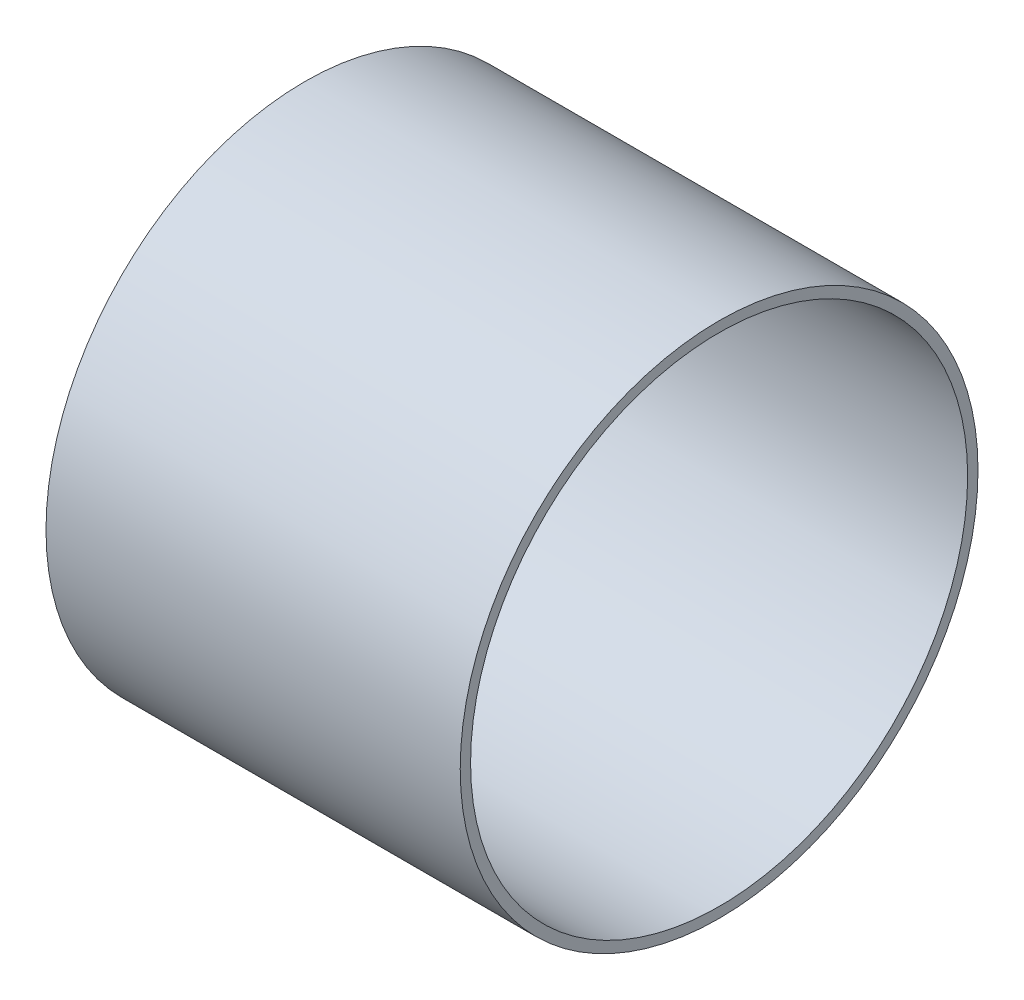
ISO-10303-21;
HEADER;
FILE_DESCRIPTION(('STEP AP214'),'2;1');
FILE_NAME('part.step','',(''),(''),'','','');
FILE_SCHEMA(('AUTOMOTIVE_DESIGN { 1 0 10303 214 1 1 1 1 }'));
ENDSEC;
DATA;
#1=APPLICATION_CONTEXT('core data for automotive mechanical design processes');
#2=APPLICATION_PROTOCOL_DEFINITION('international standard','automotive_design',2000,#1);
#3=PRODUCT_CONTEXT('',#1,'mechanical');
#4=PRODUCT('Part','Part','',(#3));
#5=PRODUCT_RELATED_PRODUCT_CATEGORY('part','',(#4));
#6=PRODUCT_DEFINITION_FORMATION('','',#4);
#7=PRODUCT_DEFINITION_CONTEXT('part definition',#1,'design');
#8=PRODUCT_DEFINITION('design','',#6,#7);
#9=PRODUCT_DEFINITION_SHAPE('','',#8);
#10=(LENGTH_UNIT() NAMED_UNIT(*) SI_UNIT(.MILLI.,.METRE.));
#11=(NAMED_UNIT(*) PLANE_ANGLE_UNIT() SI_UNIT($,.RADIAN.));
#12=(NAMED_UNIT(*) SI_UNIT($,.STERADIAN.) SOLID_ANGLE_UNIT());
#13=UNCERTAINTY_MEASURE_WITH_UNIT(LENGTH_MEASURE(1.E-05),#10,'distance_accuracy_value','');
#14=(GEOMETRIC_REPRESENTATION_CONTEXT(3) GLOBAL_UNCERTAINTY_ASSIGNED_CONTEXT((#13)) GLOBAL_UNIT_ASSIGNED_CONTEXT((#10,
#11,#12)) REPRESENTATION_CONTEXT('',''));
#15=CARTESIAN_POINT('',(0.,0.,0.));
#16=DIRECTION('',(0.,0.,1.));
#17=DIRECTION('',(1.,0.,0.));
#18=AXIS2_PLACEMENT_3D('',#15,#16,#17);
#19=CARTESIAN_POINT('',(-40.,0.,0.));
#20=DIRECTION('',(1.,0.,0.));
#21=DIRECTION('',(0.,0.,-1.));
#22=AXIS2_PLACEMENT_3D('',#19,#20,#21);
#23=CYLINDRICAL_SURFACE('',#22,25.);
#24=CARTESIAN_POINT('',(-40.,0.,0.));
#25=DIRECTION('',(1.,0.,0.));
#26=DIRECTION('',(0.,0.,-1.));
#27=AXIS2_PLACEMENT_3D('',#24,#25,#26);
#28=CIRCLE('',#27,25.);
#29=CARTESIAN_POINT('',(-40.,0.,-25.));
#30=VERTEX_POINT('',#29);
#31=EDGE_CURVE('E10',#30,#30,#28,.T.);
#32=ORIENTED_EDGE('',*,*,#31,.T.);
#33=EDGE_LOOP('',(#32));
#34=FACE_BOUND('',#33,.T.);
#35=CARTESIAN_POINT('',(0.,0.,0.));
#36=DIRECTION('',(1.,0.,0.));
#37=DIRECTION('',(0.,0.,-1.));
#38=AXIS2_PLACEMENT_3D('',#35,#36,#37);
#39=CIRCLE('',#38,25.);
#40=CARTESIAN_POINT('',(0.,0.,-25.));
#41=VERTEX_POINT('',#40);
#42=EDGE_CURVE('E33',#41,#41,#39,.T.);
#43=ORIENTED_EDGE('',*,*,#42,.F.);
#44=EDGE_LOOP('',(#43));
#45=FACE_BOUND('',#44,.T.);
#46=ADVANCED_FACE('F30',(#34,#45),#23,.T.);
#47=CARTESIAN_POINT('',(-40.,0.,0.));
#48=DIRECTION('',(1.,0.,0.));
#49=DIRECTION('',(0.,0.,-1.));
#50=AXIS2_PLACEMENT_3D('',#47,#48,#49);
#51=PLANE('',#50);
#52=CARTESIAN_POINT('',(-40.,0.,0.));
#53=DIRECTION('',(1.,0.,0.));
#54=DIRECTION('',(0.,0.,-1.));
#55=AXIS2_PLACEMENT_3D('',#52,#53,#54);
#56=CIRCLE('',#55,24.);
#57=CARTESIAN_POINT('',(-40.,0.,-24.));
#58=VERTEX_POINT('',#57);
#59=EDGE_CURVE('E40',#58,#58,#56,.T.);
#60=ORIENTED_EDGE('',*,*,#59,.T.);
#61=EDGE_LOOP('',(#60));
#62=FACE_BOUND('',#61,.T.);
#63=ORIENTED_EDGE('',*,*,#31,.F.);
#64=EDGE_LOOP('',(#63));
#65=FACE_BOUND('',#64,.T.);
#66=ADVANCED_FACE('F48',(#62,#65),#51,.F.);
#67=CARTESIAN_POINT('',(0.,0.,0.));
#68=DIRECTION('',(1.,0.,0.));
#69=DIRECTION('',(0.,0.,-1.));
#70=AXIS2_PLACEMENT_3D('',#67,#68,#69);
#71=PLANE('',#70);
#72=CARTESIAN_POINT('',(0.,0.,0.));
#73=DIRECTION('',(1.,0.,0.));
#74=DIRECTION('',(0.,0.,-1.));
#75=AXIS2_PLACEMENT_3D('',#72,#73,#74);
#76=CIRCLE('',#75,24.);
#77=CARTESIAN_POINT('',(0.,0.,-24.));
#78=VERTEX_POINT('',#77);
#79=EDGE_CURVE('E42',#78,#78,#76,.T.);
#80=ORIENTED_EDGE('',*,*,#79,.F.);
#81=EDGE_LOOP('',(#80));
#82=FACE_BOUND('',#81,.T.);
#83=ORIENTED_EDGE('',*,*,#42,.T.);
#84=EDGE_LOOP('',(#83));
#85=FACE_BOUND('',#84,.T.);
#86=ADVANCED_FACE('F54',(#82,#85),#71,.T.);
#87=CARTESIAN_POINT('',(-40.,0.,0.));
#88=DIRECTION('',(1.,0.,0.));
#89=DIRECTION('',(0.,0.,-1.));
#90=AXIS2_PLACEMENT_3D('',#87,#88,#89);
#91=CYLINDRICAL_SURFACE('',#90,24.);
#92=ORIENTED_EDGE('',*,*,#59,.F.);
#93=EDGE_LOOP('',(#92));
#94=FACE_BOUND('',#93,.T.);
#95=ORIENTED_EDGE('',*,*,#79,.T.);
#96=EDGE_LOOP('',(#95));
#97=FACE_BOUND('',#96,.T.);
#98=ADVANCED_FACE('F51',(#94,#97),#91,.F.);
#99=CLOSED_SHELL('',(#46,#66,#86,#98));
#100=MANIFOLD_SOLID_BREP('B2',#99);
#101=ADVANCED_BREP_SHAPE_REPRESENTATION('',(#18,#100),#14);
#102=SHAPE_DEFINITION_REPRESENTATION(#9,#101);
ENDSEC;
END-ISO-10303-21;
